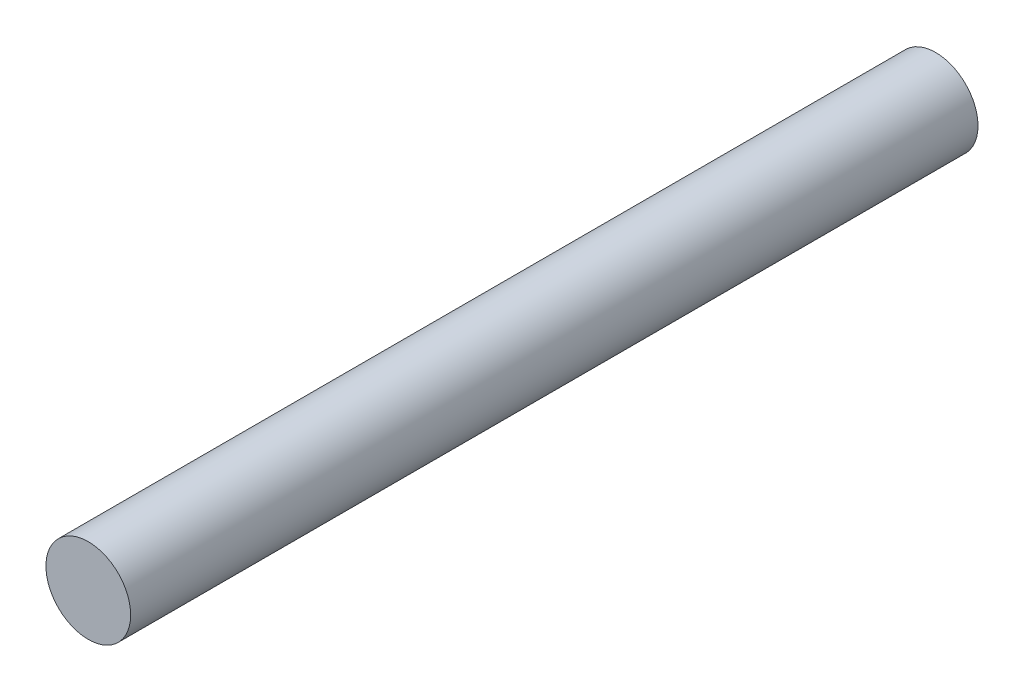
ISO-10303-21;
HEADER;
FILE_DESCRIPTION(('STEP AP214'),'2;1');
FILE_NAME('part.step','',(''),(''),'','','');
FILE_SCHEMA(('AUTOMOTIVE_DESIGN { 1 0 10303 214 1 1 1 1 }'));
ENDSEC;
DATA;
#1=APPLICATION_CONTEXT('core data for automotive mechanical design processes');
#2=APPLICATION_PROTOCOL_DEFINITION('international standard','automotive_design',2000,#1);
#3=PRODUCT_CONTEXT('',#1,'mechanical');
#4=PRODUCT('Part','Part','',(#3));
#5=PRODUCT_RELATED_PRODUCT_CATEGORY('part','',(#4));
#6=PRODUCT_DEFINITION_FORMATION('','',#4);
#7=PRODUCT_DEFINITION_CONTEXT('part definition',#1,'design');
#8=PRODUCT_DEFINITION('design','',#6,#7);
#9=PRODUCT_DEFINITION_SHAPE('','',#8);
#10=(LENGTH_UNIT() NAMED_UNIT(*) SI_UNIT(.MILLI.,.METRE.));
#11=(NAMED_UNIT(*) PLANE_ANGLE_UNIT() SI_UNIT($,.RADIAN.));
#12=(NAMED_UNIT(*) SI_UNIT($,.STERADIAN.) SOLID_ANGLE_UNIT());
#13=UNCERTAINTY_MEASURE_WITH_UNIT(LENGTH_MEASURE(1.E-05),#10,'distance_accuracy_value','');
#14=(GEOMETRIC_REPRESENTATION_CONTEXT(3) GLOBAL_UNCERTAINTY_ASSIGNED_CONTEXT((#13)) GLOBAL_UNIT_ASSIGNED_CONTEXT((#10,
#11,#12)) REPRESENTATION_CONTEXT('',''));
#15=CARTESIAN_POINT('',(0.,0.,0.));
#16=DIRECTION('',(0.,0.,1.));
#17=DIRECTION('',(1.,0.,0.));
#18=AXIS2_PLACEMENT_3D('',#15,#16,#17);
#19=CARTESIAN_POINT('',(0.,0.,4.));
#20=DIRECTION('',(0.,0.,1.));
#21=DIRECTION('',(1.,0.,0.));
#22=AXIS2_PLACEMENT_3D('',#19,#20,#21);
#23=PLANE('',#22);
#24=CARTESIAN_POINT('',(0.,0.,4.));
#25=DIRECTION('',(0.,0.,1.));
#26=DIRECTION('',(1.,0.,0.));
#27=AXIS2_PLACEMENT_3D('',#24,#25,#26);
#28=CIRCLE('',#27,0.2);
#29=CARTESIAN_POINT('',(0.2,0.,4.));
#30=VERTEX_POINT('',#29);
#31=EDGE_CURVE('E11',#30,#30,#28,.T.);
#32=ORIENTED_EDGE('',*,*,#31,.T.);
#33=EDGE_LOOP('',(#32));
#34=FACE_BOUND('',#33,.T.);
#35=ADVANCED_FACE('F18',(#34),#23,.T.);
#36=CARTESIAN_POINT('',(0.,0.,0.));
#37=DIRECTION('',(0.,0.,1.));
#38=DIRECTION('',(1.,0.,0.));
#39=AXIS2_PLACEMENT_3D('',#36,#37,#38);
#40=PLANE('',#39);
#41=CARTESIAN_POINT('',(0.,0.,0.));
#42=DIRECTION('',(0.,0.,1.));
#43=DIRECTION('',(1.,0.,0.));
#44=AXIS2_PLACEMENT_3D('',#41,#42,#43);
#45=CIRCLE('',#44,0.2);
#46=CARTESIAN_POINT('',(0.2,0.,0.));
#47=VERTEX_POINT('',#46);
#48=EDGE_CURVE('E43',#47,#47,#45,.T.);
#49=ORIENTED_EDGE('',*,*,#48,.F.);
#50=EDGE_LOOP('',(#49));
#51=FACE_BOUND('',#50,.T.);
#52=ADVANCED_FACE('F73',(#51),#40,.F.);
#53=CARTESIAN_POINT('',(0.,0.,0.));
#54=DIRECTION('',(0.,0.,-1.));
#55=DIRECTION('',(1.,0.,0.));
#56=AXIS2_PLACEMENT_3D('',#53,#54,#55);
#57=CYLINDRICAL_SURFACE('',#56,0.2);
#58=ORIENTED_EDGE('',*,*,#48,.T.);
#59=DIRECTION('',(0.,0.,1.));
#60=VECTOR('',#59,1.);
#61=CARTESIAN_POINT('',(0.2,0.,0.));
#62=LINE('',#61,#60);
#63=EDGE_CURVE('E26',#47,#30,#62,.T.);
#64=ORIENTED_EDGE('',*,*,#63,.T.);
#65=ORIENTED_EDGE('',*,*,#31,.F.);
#66=ORIENTED_EDGE('',*,*,#63,.F.);
#67=EDGE_LOOP('',(#58,#64,#65,#66));
#68=FACE_BOUND('',#67,.T.);
#69=ADVANCED_FACE('F41',(#68),#57,.T.);
#70=CLOSED_SHELL('',(#35,#52,#69));
#71=MANIFOLD_SOLID_BREP('B1',#70);
#72=ADVANCED_BREP_SHAPE_REPRESENTATION('',(#18,#71),#14);
#73=SHAPE_DEFINITION_REPRESENTATION(#9,#72);
ENDSEC;
END-ISO-10303-21;
